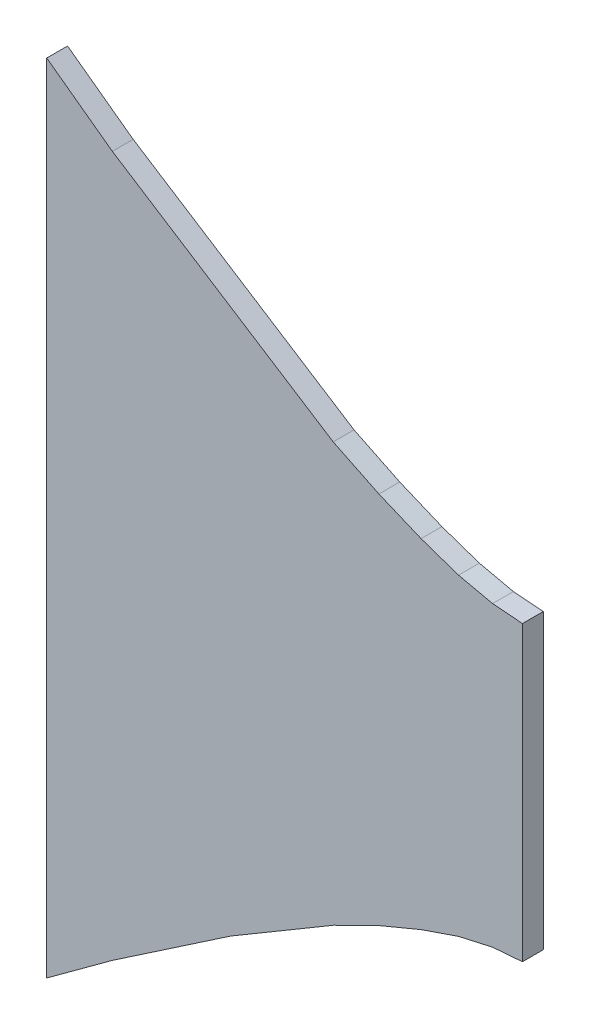
ISO-10303-21;
HEADER;
FILE_DESCRIPTION(('STEP AP214'),'2;1');
FILE_NAME('part.step','',(''),(''),'','','');
FILE_SCHEMA(('AUTOMOTIVE_DESIGN { 1 0 10303 214 1 1 1 1 }'));
ENDSEC;
DATA;
#1=APPLICATION_CONTEXT('core data for automotive mechanical design processes');
#2=APPLICATION_PROTOCOL_DEFINITION('international standard','automotive_design',2000,#1);
#3=PRODUCT_CONTEXT('',#1,'mechanical');
#4=PRODUCT('Part','Part','',(#3));
#5=PRODUCT_RELATED_PRODUCT_CATEGORY('part','',(#4));
#6=PRODUCT_DEFINITION_FORMATION('','',#4);
#7=PRODUCT_DEFINITION_CONTEXT('part definition',#1,'design');
#8=PRODUCT_DEFINITION('design','',#6,#7);
#9=PRODUCT_DEFINITION_SHAPE('','',#8);
#10=(LENGTH_UNIT() NAMED_UNIT(*) SI_UNIT(.MILLI.,.METRE.));
#11=(NAMED_UNIT(*) PLANE_ANGLE_UNIT() SI_UNIT($,.RADIAN.));
#12=(NAMED_UNIT(*) SI_UNIT($,.STERADIAN.) SOLID_ANGLE_UNIT());
#13=UNCERTAINTY_MEASURE_WITH_UNIT(LENGTH_MEASURE(1.E-05),#10,'distance_accuracy_value','');
#14=(GEOMETRIC_REPRESENTATION_CONTEXT(3) GLOBAL_UNCERTAINTY_ASSIGNED_CONTEXT((#13)) GLOBAL_UNIT_ASSIGNED_CONTEXT((#10,
#11,#12)) REPRESENTATION_CONTEXT('',''));
#15=CARTESIAN_POINT('',(0.,0.,0.));
#16=DIRECTION('',(0.,0.,1.));
#17=DIRECTION('',(1.,0.,0.));
#18=AXIS2_PLACEMENT_3D('',#15,#16,#17);
#19=CARTESIAN_POINT('',(40.7220001220703,86.0899963378906,0.));
#20=DIRECTION('',(-0.0782987833422963,-0.996929937622056,0.));
#21=DIRECTION('',(-0.996929937622056,0.0782987833422963,0.));
#22=AXIS2_PLACEMENT_3D('',#19,#20,#21);
#23=PLANE('',#22);
#24=DIRECTION('',(-0.996929937622056,0.0782987833422963,0.));
#25=VECTOR('',#24,1.);
#26=CARTESIAN_POINT('',(40.7220001220703,86.0899963378906,0.03556));
#27=LINE('',#26,#25);
#28=CARTESIAN_POINT('',(40.7220001220703,86.0899963378906,0.03556));
#29=VERTEX_POINT('',#28);
#30=CARTESIAN_POINT('',(40.6710014343262,86.0940017700195,0.03556));
#31=VERTEX_POINT('',#30);
#32=EDGE_CURVE('E11',#29,#31,#27,.T.);
#33=ORIENTED_EDGE('',*,*,#32,.F.);
#34=DIRECTION('',(0.,0.,1.));
#35=VECTOR('',#34,1.);
#36=CARTESIAN_POINT('',(40.7220001220703,86.0899963378906,0.));
#37=LINE('',#36,#35);
#38=CARTESIAN_POINT('',(40.7220001220703,86.0899963378906,0.));
#39=VERTEX_POINT('',#38);
#40=EDGE_CURVE('E24',#39,#29,#37,.T.);
#41=ORIENTED_EDGE('',*,*,#40,.F.);
#42=DIRECTION('',(-0.996929937622056,0.0782987833422963,0.));
#43=VECTOR('',#42,1.);
#44=CARTESIAN_POINT('',(40.7220001220703,86.0899963378906,0.));
#45=LINE('',#44,#43);
#46=CARTESIAN_POINT('',(40.6710014343262,86.0940017700195,0.));
#47=VERTEX_POINT('',#46);
#48=EDGE_CURVE('E154',#39,#47,#45,.T.);
#49=ORIENTED_EDGE('',*,*,#48,.T.);
#50=DIRECTION('',(0.,0.,1.));
#51=VECTOR('',#50,1.);
#52=CARTESIAN_POINT('',(40.6710014343262,86.0940017700195,0.));
#53=LINE('',#52,#51);
#54=EDGE_CURVE('E37',#47,#31,#53,.T.);
#55=ORIENTED_EDGE('',*,*,#54,.T.);
#56=EDGE_LOOP('',(#33,#41,#49,#55));
#57=FACE_BOUND('',#56,.T.);
#58=ADVANCED_FACE('F17',(#57),#23,.F.);
#59=CARTESIAN_POINT('',(40.6710014343262,86.0940017700195,0.));
#60=DIRECTION('',(-0.218710403369533,-0.975789813155444,0.));
#61=DIRECTION('',(-0.975789813155444,0.218710403369533,0.));
#62=AXIS2_PLACEMENT_3D('',#59,#60,#61);
#63=PLANE('',#62);
#64=DIRECTION('',(-0.975789813155444,0.218710403369533,0.));
#65=VECTOR('',#64,1.);
#66=CARTESIAN_POINT('',(40.6710014343262,86.0940017700195,0.03556));
#67=LINE('',#66,#65);
#68=CARTESIAN_POINT('',(40.6129989624023,86.1070022583008,0.03556));
#69=VERTEX_POINT('',#68);
#70=EDGE_CURVE('E266',#31,#69,#67,.T.);
#71=ORIENTED_EDGE('',*,*,#70,.F.);
#72=ORIENTED_EDGE('',*,*,#54,.F.);
#73=DIRECTION('',(-0.975789813155444,0.218710403369533,0.));
#74=VECTOR('',#73,1.);
#75=CARTESIAN_POINT('',(40.6710014343262,86.0940017700195,0.));
#76=LINE('',#75,#74);
#77=CARTESIAN_POINT('',(40.6129989624023,86.1070022583008,0.));
#78=VERTEX_POINT('',#77);
#79=EDGE_CURVE('E263',#47,#78,#76,.T.);
#80=ORIENTED_EDGE('',*,*,#79,.T.);
#81=DIRECTION('',(0.,0.,1.));
#82=VECTOR('',#81,1.);
#83=CARTESIAN_POINT('',(40.6129989624023,86.1070022583008,0.));
#84=LINE('',#83,#82);
#85=EDGE_CURVE('E261',#78,#69,#84,.T.);
#86=ORIENTED_EDGE('',*,*,#85,.T.);
#87=EDGE_LOOP('',(#71,#72,#80,#86));
#88=FACE_BOUND('',#87,.T.);
#89=ADVANCED_FACE('F274',(#88),#63,.F.);
#90=CARTESIAN_POINT('',(40.6129989624023,86.1070022583008,0.));
#91=DIRECTION('',(-0.32502462955719,-0.945705551522889,0.));
#92=DIRECTION('',(-0.945705551522889,0.32502462955719,0.));
#93=AXIS2_PLACEMENT_3D('',#90,#91,#92);
#94=PLANE('',#93);
#95=DIRECTION('',(-0.945705551522889,0.32502462955719,0.));
#96=VECTOR('',#95,1.);
#97=CARTESIAN_POINT('',(40.6129989624023,86.1070022583008,0.03556));
#98=LINE('',#97,#96);
#99=CARTESIAN_POINT('',(40.5489997863769,86.1289978027344,0.03556));
#100=VERTEX_POINT('',#99);
#101=EDGE_CURVE('E258',#69,#100,#98,.T.);
#102=ORIENTED_EDGE('',*,*,#101,.F.);
#103=ORIENTED_EDGE('',*,*,#85,.F.);
#104=DIRECTION('',(-0.945705551522889,0.32502462955719,0.));
#105=VECTOR('',#104,1.);
#106=CARTESIAN_POINT('',(40.6129989624023,86.1070022583008,0.));
#107=LINE('',#106,#105);
#108=CARTESIAN_POINT('',(40.5489997863769,86.1289978027344,0.));
#109=VERTEX_POINT('',#108);
#110=EDGE_CURVE('E255',#78,#109,#107,.T.);
#111=ORIENTED_EDGE('',*,*,#110,.T.);
#112=DIRECTION('',(0.,0.,1.));
#113=VECTOR('',#112,1.);
#114=CARTESIAN_POINT('',(40.5489997863769,86.1289978027344,0.));
#115=LINE('',#114,#113);
#116=EDGE_CURVE('E253',#109,#100,#115,.T.);
#117=ORIENTED_EDGE('',*,*,#116,.T.);
#118=EDGE_LOOP('',(#102,#103,#111,#117));
#119=FACE_BOUND('',#118,.T.);
#120=ADVANCED_FACE('F280',(#119),#94,.F.);
#121=CARTESIAN_POINT('',(40.5489997863769,86.1289978027344,0.));
#122=DIRECTION('',(-0.384608439163254,-0.923079816984645,0.));
#123=DIRECTION('',(-0.923079816984645,0.384608439163254,0.));
#124=AXIS2_PLACEMENT_3D('',#121,#122,#123);
#125=PLANE('',#124);
#126=DIRECTION('',(-0.923079816984645,0.384608439163254,0.));
#127=VECTOR('',#126,1.);
#128=CARTESIAN_POINT('',(40.5489997863769,86.1289978027344,0.03556));
#129=LINE('',#128,#127);
#130=CARTESIAN_POINT('',(40.4770011901855,86.1589965820312,0.03556));
#131=VERTEX_POINT('',#130);
#132=EDGE_CURVE('E250',#100,#131,#129,.T.);
#133=ORIENTED_EDGE('',*,*,#132,.F.);
#134=ORIENTED_EDGE('',*,*,#116,.F.);
#135=DIRECTION('',(-0.923079816984645,0.384608439163254,0.));
#136=VECTOR('',#135,1.);
#137=CARTESIAN_POINT('',(40.5489997863769,86.1289978027344,0.));
#138=LINE('',#137,#136);
#139=CARTESIAN_POINT('',(40.4770011901855,86.1589965820312,0.));
#140=VERTEX_POINT('',#139);
#141=EDGE_CURVE('E247',#109,#140,#138,.T.);
#142=ORIENTED_EDGE('',*,*,#141,.T.);
#143=DIRECTION('',(0.,0.,1.));
#144=VECTOR('',#143,1.);
#145=CARTESIAN_POINT('',(40.4770011901855,86.1589965820312,0.));
#146=LINE('',#145,#144);
#147=EDGE_CURVE('E245',#140,#131,#146,.T.);
#148=ORIENTED_EDGE('',*,*,#147,.T.);
#149=EDGE_LOOP('',(#133,#134,#142,#148));
#150=FACE_BOUND('',#149,.T.);
#151=ADVANCED_FACE('F282',(#150),#125,.F.);
#152=CARTESIAN_POINT('',(40.4770011901855,86.1589965820313,0.));
#153=DIRECTION('',(-0.437974889640196,-0.898987205718001,0.));
#154=DIRECTION('',(-0.898987205718001,0.437974889640196,0.));
#155=AXIS2_PLACEMENT_3D('',#152,#153,#154);
#156=PLANE('',#155);
#157=DIRECTION('',(-0.898987205718,0.437974889640196,0.));
#158=VECTOR('',#157,1.);
#159=CARTESIAN_POINT('',(40.4770011901855,86.1589965820312,0.03556));
#160=LINE('',#159,#158);
#161=CARTESIAN_POINT('',(40.3989982604981,86.1969985961914,0.03556));
#162=VERTEX_POINT('',#161);
#163=EDGE_CURVE('E242',#131,#162,#160,.T.);
#164=ORIENTED_EDGE('',*,*,#163,.F.);
#165=ORIENTED_EDGE('',*,*,#147,.F.);
#166=DIRECTION('',(-0.898987205718,0.437974889640196,0.));
#167=VECTOR('',#166,1.);
#168=CARTESIAN_POINT('',(40.4770011901855,86.1589965820312,0.));
#169=LINE('',#168,#167);
#170=CARTESIAN_POINT('',(40.3989982604981,86.1969985961914,0.));
#171=VERTEX_POINT('',#170);
#172=EDGE_CURVE('E239',#140,#171,#169,.T.);
#173=ORIENTED_EDGE('',*,*,#172,.T.);
#174=DIRECTION('',(0.,0.,1.));
#175=VECTOR('',#174,1.);
#176=CARTESIAN_POINT('',(40.3989982604981,86.1969985961914,0.));
#177=LINE('',#176,#175);
#178=EDGE_CURVE('E237',#171,#162,#177,.T.);
#179=ORIENTED_EDGE('',*,*,#178,.T.);
#180=EDGE_LOOP('',(#164,#165,#173,#179));
#181=FACE_BOUND('',#180,.T.);
#182=ADVANCED_FACE('F287',(#181),#156,.F.);
#183=CARTESIAN_POINT('',(40.3989982604981,86.1969985961914,0.));
#184=DIRECTION('',(-0.538618644530784,-0.842549675546683,0.));
#185=DIRECTION('',(-0.842549675546683,0.538618644530784,0.));
#186=AXIS2_PLACEMENT_3D('',#183,#184,#185);
#187=PLANE('',#186);
#188=DIRECTION('',(-0.842549675546683,0.538618644530784,0.));
#189=VECTOR('',#188,1.);
#190=CARTESIAN_POINT('',(40.3989982604981,86.1969985961914,0.03556));
#191=LINE('',#190,#189);
#192=CARTESIAN_POINT('',(40.0219993591309,86.4380035400391,0.03556));
#193=VERTEX_POINT('',#192);
#194=EDGE_CURVE('E234',#162,#193,#191,.T.);
#195=ORIENTED_EDGE('',*,*,#194,.F.);
#196=ORIENTED_EDGE('',*,*,#178,.F.);
#197=DIRECTION('',(-0.842549675546683,0.538618644530784,0.));
#198=VECTOR('',#197,1.);
#199=CARTESIAN_POINT('',(40.3989982604981,86.1969985961914,0.));
#200=LINE('',#199,#198);
#201=CARTESIAN_POINT('',(40.0219993591309,86.4380035400391,0.));
#202=VERTEX_POINT('',#201);
#203=EDGE_CURVE('E231',#171,#202,#200,.T.);
#204=ORIENTED_EDGE('',*,*,#203,.T.);
#205=DIRECTION('',(0.,0.,1.));
#206=VECTOR('',#205,1.);
#207=CARTESIAN_POINT('',(40.0219993591309,86.4380035400391,0.));
#208=LINE('',#207,#206);
#209=EDGE_CURVE('E229',#202,#193,#208,.T.);
#210=ORIENTED_EDGE('',*,*,#209,.T.);
#211=EDGE_LOOP('',(#195,#196,#204,#210));
#212=FACE_BOUND('',#211,.T.);
#213=ADVANCED_FACE('F290',(#212),#187,.F.);
#214=CARTESIAN_POINT('',(40.0219993591309,86.4380035400391,0.));
#215=DIRECTION('',(-0.590708178306999,-0.806885275662672,0.));
#216=DIRECTION('',(-0.806885275662672,0.590708178306999,0.));
#217=AXIS2_PLACEMENT_3D('',#214,#215,#216);
#218=PLANE('',#217);
#219=DIRECTION('',(-0.806885275662672,0.590708178306999,0.));
#220=VECTOR('',#219,1.);
#221=CARTESIAN_POINT('',(40.0219993591309,86.4380035400391,0.03556));
#222=LINE('',#221,#220);
#223=CARTESIAN_POINT('',(39.9099998474121,86.5199966430664,0.03556));
#224=VERTEX_POINT('',#223);
#225=EDGE_CURVE('E226',#193,#224,#222,.T.);
#226=ORIENTED_EDGE('',*,*,#225,.F.);
#227=ORIENTED_EDGE('',*,*,#209,.F.);
#228=DIRECTION('',(-0.806885275662672,0.590708178306999,0.));
#229=VECTOR('',#228,1.);
#230=CARTESIAN_POINT('',(40.0219993591309,86.4380035400391,0.));
#231=LINE('',#230,#229);
#232=CARTESIAN_POINT('',(39.9099998474121,86.5199966430664,0.));
#233=VERTEX_POINT('',#232);
#234=EDGE_CURVE('E223',#202,#233,#231,.T.);
#235=ORIENTED_EDGE('',*,*,#234,.T.);
#236=DIRECTION('',(0.,0.,1.));
#237=VECTOR('',#236,1.);
#238=CARTESIAN_POINT('',(39.9099998474121,86.5199966430664,0.));
#239=LINE('',#238,#237);
#240=EDGE_CURVE('E221',#233,#224,#239,.T.);
#241=ORIENTED_EDGE('',*,*,#240,.T.);
#242=EDGE_LOOP('',(#226,#227,#235,#241));
#243=FACE_BOUND('',#242,.T.);
#244=ADVANCED_FACE('F295',(#243),#218,.F.);
#245=CARTESIAN_POINT('',(39.9099998474121,86.5199966430664,0.));
#246=DIRECTION('',(1.,0.,0.));
#247=DIRECTION('',(0.,-1.,0.));
#248=AXIS2_PLACEMENT_3D('',#245,#246,#247);
#249=PLANE('',#248);
#250=DIRECTION('',(0.,-1.,0.));
#251=VECTOR('',#250,1.);
#252=CARTESIAN_POINT('',(39.9099998474121,86.5199966430664,0.03556));
#253=LINE('',#252,#251);
#254=CARTESIAN_POINT('',(39.9099998474121,85.1600036621094,0.03556));
#255=VERTEX_POINT('',#254);
#256=EDGE_CURVE('E218',#224,#255,#253,.T.);
#257=ORIENTED_EDGE('',*,*,#256,.F.);
#258=ORIENTED_EDGE('',*,*,#240,.F.);
#259=DIRECTION('',(0.,-1.,0.));
#260=VECTOR('',#259,1.);
#261=CARTESIAN_POINT('',(39.9099998474121,86.5199966430664,0.));
#262=LINE('',#261,#260);
#263=CARTESIAN_POINT('',(39.9099998474121,85.1600036621094,0.));
#264=VERTEX_POINT('',#263);
#265=EDGE_CURVE('E215',#233,#264,#262,.T.);
#266=ORIENTED_EDGE('',*,*,#265,.T.);
#267=DIRECTION('',(0.,0.,1.));
#268=VECTOR('',#267,1.);
#269=CARTESIAN_POINT('',(39.9099998474121,85.1600036621094,0.));
#270=LINE('',#269,#268);
#271=EDGE_CURVE('E213',#264,#255,#270,.T.);
#272=ORIENTED_EDGE('',*,*,#271,.T.);
#273=EDGE_LOOP('',(#257,#258,#266,#272));
#274=FACE_BOUND('',#273,.T.);
#275=ADVANCED_FACE('F298',(#274),#249,.F.);
#276=CARTESIAN_POINT('',(39.9099998474121,85.1600036621094,0.));
#277=DIRECTION('',(-0.590708178306999,0.806885275662672,0.));
#278=DIRECTION('',(0.806885275662672,0.590708178306999,0.));
#279=AXIS2_PLACEMENT_3D('',#276,#277,#278);
#280=PLANE('',#279);
#281=DIRECTION('',(0.806885275662672,0.590708178306999,0.));
#282=VECTOR('',#281,1.);
#283=CARTESIAN_POINT('',(39.9099998474121,85.1600036621094,0.03556));
#284=LINE('',#283,#282);
#285=CARTESIAN_POINT('',(40.0219993591309,85.2419967651367,0.03556));
#286=VERTEX_POINT('',#285);
#287=EDGE_CURVE('E210',#255,#286,#284,.T.);
#288=ORIENTED_EDGE('',*,*,#287,.F.);
#289=ORIENTED_EDGE('',*,*,#271,.F.);
#290=DIRECTION('',(0.806885275662672,0.590708178306999,0.));
#291=VECTOR('',#290,1.);
#292=CARTESIAN_POINT('',(39.9099998474121,85.1600036621094,0.));
#293=LINE('',#292,#291);
#294=CARTESIAN_POINT('',(40.0219993591309,85.2419967651367,0.));
#295=VERTEX_POINT('',#294);
#296=EDGE_CURVE('E207',#264,#295,#293,.T.);
#297=ORIENTED_EDGE('',*,*,#296,.T.);
#298=DIRECTION('',(0.,0.,1.));
#299=VECTOR('',#298,1.);
#300=CARTESIAN_POINT('',(40.0219993591309,85.2419967651367,0.));
#301=LINE('',#300,#299);
#302=EDGE_CURVE('E205',#295,#286,#301,.T.);
#303=ORIENTED_EDGE('',*,*,#302,.T.);
#304=EDGE_LOOP('',(#288,#289,#297,#303));
#305=FACE_BOUND('',#304,.T.);
#306=ADVANCED_FACE('F303',(#305),#280,.F.);
#307=CARTESIAN_POINT('',(40.0219993591309,85.2419967651367,0.));
#308=DIRECTION('',(-0.561304570964436,0.827609315205206,0.));
#309=DIRECTION('',(0.827609315205206,0.561304570964436,0.));
#310=AXIS2_PLACEMENT_3D('',#307,#308,#309);
#311=PLANE('',#310);
#312=DIRECTION('',(0.827609315205206,0.561304570964436,0.));
#313=VECTOR('',#312,1.);
#314=CARTESIAN_POINT('',(40.0219993591309,85.2419967651367,0.03556));
#315=LINE('',#314,#313);
#316=CARTESIAN_POINT('',(40.2239990234375,85.3789978027344,0.03556));
#317=VERTEX_POINT('',#316);
#318=EDGE_CURVE('E202',#286,#317,#315,.T.);
#319=ORIENTED_EDGE('',*,*,#318,.F.);
#320=ORIENTED_EDGE('',*,*,#302,.F.);
#321=DIRECTION('',(0.827609315205206,0.561304570964436,0.));
#322=VECTOR('',#321,1.);
#323=CARTESIAN_POINT('',(40.0219993591309,85.2419967651367,0.));
#324=LINE('',#323,#322);
#325=CARTESIAN_POINT('',(40.2239990234375,85.3789978027344,0.));
#326=VERTEX_POINT('',#325);
#327=EDGE_CURVE('E199',#295,#326,#324,.T.);
#328=ORIENTED_EDGE('',*,*,#327,.T.);
#329=DIRECTION('',(0.,0.,1.));
#330=VECTOR('',#329,1.);
#331=CARTESIAN_POINT('',(40.2239990234375,85.3789978027344,0.));
#332=LINE('',#331,#330);
#333=EDGE_CURVE('E197',#326,#317,#332,.T.);
#334=ORIENTED_EDGE('',*,*,#333,.T.);
#335=EDGE_LOOP('',(#319,#320,#328,#334));
#336=FACE_BOUND('',#335,.T.);
#337=ADVANCED_FACE('F306',(#336),#311,.F.);
#338=CARTESIAN_POINT('',(40.2239990234375,85.3789978027344,0.));
#339=DIRECTION('',(-0.508738113307092,0.860921327456081,0.));
#340=DIRECTION('',(0.860921327456081,0.508738113307092,0.));
#341=AXIS2_PLACEMENT_3D('',#338,#339,#340);
#342=PLANE('',#341);
#343=DIRECTION('',(0.860921327456081,0.508738113307092,0.));
#344=VECTOR('',#343,1.);
#345=CARTESIAN_POINT('',(40.2239990234375,85.3789978027344,0.03556));
#346=LINE('',#345,#344);
#347=CARTESIAN_POINT('',(40.4000015258789,85.4830017089844,0.03556));
#348=VERTEX_POINT('',#347);
#349=EDGE_CURVE('E194',#317,#348,#346,.T.);
#350=ORIENTED_EDGE('',*,*,#349,.F.);
#351=ORIENTED_EDGE('',*,*,#333,.F.);
#352=DIRECTION('',(0.860921327456081,0.508738113307092,0.));
#353=VECTOR('',#352,1.);
#354=CARTESIAN_POINT('',(40.2239990234375,85.3789978027344,0.));
#355=LINE('',#354,#353);
#356=CARTESIAN_POINT('',(40.4000015258789,85.4830017089844,0.));
#357=VERTEX_POINT('',#356);
#358=EDGE_CURVE('E191',#326,#357,#355,.T.);
#359=ORIENTED_EDGE('',*,*,#358,.T.);
#360=DIRECTION('',(0.,0.,1.));
#361=VECTOR('',#360,1.);
#362=CARTESIAN_POINT('',(40.4000015258789,85.4830017089844,0.));
#363=LINE('',#362,#361);
#364=EDGE_CURVE('E189',#357,#348,#363,.T.);
#365=ORIENTED_EDGE('',*,*,#364,.T.);
#366=EDGE_LOOP('',(#350,#351,#359,#365));
#367=FACE_BOUND('',#366,.T.);
#368=ADVANCED_FACE('F311',(#367),#342,.F.);
#369=CARTESIAN_POINT('',(40.4000015258789,85.4830017089844,0.));
#370=DIRECTION('',(-0.442569532299855,0.896734190872573,0.));
#371=DIRECTION('',(0.896734190872573,0.442569532299855,0.));
#372=AXIS2_PLACEMENT_3D('',#369,#370,#371);
#373=PLANE('',#372);
#374=DIRECTION('',(0.896734190872573,0.442569532299855,0.));
#375=VECTOR('',#374,1.);
#376=CARTESIAN_POINT('',(40.4000015258789,85.4830017089844,0.03556));
#377=LINE('',#376,#375);
#378=CARTESIAN_POINT('',(40.4770011901855,85.5210037231445,0.03556));
#379=VERTEX_POINT('',#378);
#380=EDGE_CURVE('E186',#348,#379,#377,.T.);
#381=ORIENTED_EDGE('',*,*,#380,.F.);
#382=ORIENTED_EDGE('',*,*,#364,.F.);
#383=DIRECTION('',(0.896734190872573,0.442569532299855,0.));
#384=VECTOR('',#383,1.);
#385=CARTESIAN_POINT('',(40.4000015258789,85.4830017089844,0.));
#386=LINE('',#385,#384);
#387=CARTESIAN_POINT('',(40.4770011901855,85.5210037231445,0.));
#388=VERTEX_POINT('',#387);
#389=EDGE_CURVE('E183',#357,#388,#386,.T.);
#390=ORIENTED_EDGE('',*,*,#389,.T.);
#391=DIRECTION('',(0.,0.,1.));
#392=VECTOR('',#391,1.);
#393=CARTESIAN_POINT('',(40.4770011901855,85.5210037231445,0.));
#394=LINE('',#393,#392);
#395=EDGE_CURVE('E181',#388,#379,#394,.T.);
#396=ORIENTED_EDGE('',*,*,#395,.T.);
#397=EDGE_LOOP('',(#381,#382,#390,#396));
#398=FACE_BOUND('',#397,.T.);
#399=ADVANCED_FACE('F314',(#398),#373,.F.);
#400=CARTESIAN_POINT('',(40.4770011901855,85.5210037231445,0.));
#401=DIRECTION('',(-0.384608439163254,0.923079816984645,0.));
#402=DIRECTION('',(0.923079816984645,0.384608439163254,0.));
#403=AXIS2_PLACEMENT_3D('',#400,#401,#402);
#404=PLANE('',#403);
#405=DIRECTION('',(0.923079816984645,0.384608439163254,0.));
#406=VECTOR('',#405,1.);
#407=CARTESIAN_POINT('',(40.4770011901855,85.5210037231445,0.03556));
#408=LINE('',#407,#406);
#409=CARTESIAN_POINT('',(40.5489997863769,85.5510025024414,0.03556));
#410=VERTEX_POINT('',#409);
#411=EDGE_CURVE('E178',#379,#410,#408,.T.);
#412=ORIENTED_EDGE('',*,*,#411,.F.);
#413=ORIENTED_EDGE('',*,*,#395,.F.);
#414=DIRECTION('',(0.923079816984645,0.384608439163254,0.));
#415=VECTOR('',#414,1.);
#416=CARTESIAN_POINT('',(40.4770011901855,85.5210037231445,0.));
#417=LINE('',#416,#415);
#418=CARTESIAN_POINT('',(40.5489997863769,85.5510025024414,0.));
#419=VERTEX_POINT('',#418);
#420=EDGE_CURVE('E175',#388,#419,#417,.T.);
#421=ORIENTED_EDGE('',*,*,#420,.T.);
#422=DIRECTION('',(0.,0.,1.));
#423=VECTOR('',#422,1.);
#424=CARTESIAN_POINT('',(40.5489997863769,85.5510025024414,0.));
#425=LINE('',#424,#423);
#426=EDGE_CURVE('E173',#419,#410,#425,.T.);
#427=ORIENTED_EDGE('',*,*,#426,.T.);
#428=EDGE_LOOP('',(#412,#413,#421,#427));
#429=FACE_BOUND('',#428,.T.);
#430=ADVANCED_FACE('F319',(#429),#404,.F.);
#431=CARTESIAN_POINT('',(40.5489997863769,85.5510025024414,0.));
#432=DIRECTION('',(-0.32502462955719,0.945705551522889,0.));
#433=DIRECTION('',(0.945705551522889,0.32502462955719,0.));
#434=AXIS2_PLACEMENT_3D('',#431,#432,#433);
#435=PLANE('',#434);
#436=DIRECTION('',(0.945705551522889,0.32502462955719,0.));
#437=VECTOR('',#436,1.);
#438=CARTESIAN_POINT('',(40.5489997863769,85.5510025024414,0.03556));
#439=LINE('',#438,#437);
#440=CARTESIAN_POINT('',(40.6129989624023,85.572998046875,0.03556));
#441=VERTEX_POINT('',#440);
#442=EDGE_CURVE('E170',#410,#441,#439,.T.);
#443=ORIENTED_EDGE('',*,*,#442,.F.);
#444=ORIENTED_EDGE('',*,*,#426,.F.);
#445=DIRECTION('',(0.945705551522889,0.32502462955719,0.));
#446=VECTOR('',#445,1.);
#447=CARTESIAN_POINT('',(40.5489997863769,85.5510025024414,0.));
#448=LINE('',#447,#446);
#449=CARTESIAN_POINT('',(40.6129989624023,85.572998046875,0.));
#450=VERTEX_POINT('',#449);
#451=EDGE_CURVE('E167',#419,#450,#448,.T.);
#452=ORIENTED_EDGE('',*,*,#451,.T.);
#453=DIRECTION('',(0.,0.,1.));
#454=VECTOR('',#453,1.);
#455=CARTESIAN_POINT('',(40.6129989624023,85.572998046875,0.));
#456=LINE('',#455,#454);
#457=EDGE_CURVE('E165',#450,#441,#456,.T.);
#458=ORIENTED_EDGE('',*,*,#457,.T.);
#459=EDGE_LOOP('',(#443,#444,#452,#458));
#460=FACE_BOUND('',#459,.T.);
#461=ADVANCED_FACE('F322',(#460),#435,.F.);
#462=CARTESIAN_POINT('',(40.6129989624023,85.572998046875,0.));
#463=DIRECTION('',(-0.218710403369533,0.975789813155444,0.));
#464=DIRECTION('',(0.975789813155444,0.218710403369533,0.));
#465=AXIS2_PLACEMENT_3D('',#462,#463,#464);
#466=PLANE('',#465);
#467=DIRECTION('',(0.975789813155444,0.218710403369533,0.));
#468=VECTOR('',#467,1.);
#469=CARTESIAN_POINT('',(40.6129989624023,85.572998046875,0.03556));
#470=LINE('',#469,#468);
#471=CARTESIAN_POINT('',(40.6710014343262,85.5859985351562,0.03556));
#472=VERTEX_POINT('',#471);
#473=EDGE_CURVE('E162',#441,#472,#470,.T.);
#474=ORIENTED_EDGE('',*,*,#473,.F.);
#475=ORIENTED_EDGE('',*,*,#457,.F.);
#476=DIRECTION('',(0.975789813155444,0.218710403369533,0.));
#477=VECTOR('',#476,1.);
#478=CARTESIAN_POINT('',(40.6129989624023,85.572998046875,0.));
#479=LINE('',#478,#477);
#480=CARTESIAN_POINT('',(40.6710014343262,85.5859985351562,0.));
#481=VERTEX_POINT('',#480);
#482=EDGE_CURVE('E160',#450,#481,#479,.T.);
#483=ORIENTED_EDGE('',*,*,#482,.T.);
#484=DIRECTION('',(0.,0.,1.));
#485=VECTOR('',#484,1.);
#486=CARTESIAN_POINT('',(40.6710014343262,85.5859985351562,0.));
#487=LINE('',#486,#485);
#488=EDGE_CURVE('E145',#481,#472,#487,.T.);
#489=ORIENTED_EDGE('',*,*,#488,.T.);
#490=EDGE_LOOP('',(#474,#475,#483,#489));
#491=FACE_BOUND('',#490,.T.);
#492=ADVANCED_FACE('F325',(#491),#466,.F.);
#493=CARTESIAN_POINT('',(40.6710014343262,85.5859985351562,0.));
#494=DIRECTION('',(-0.0781505545436505,0.996941568410366,0.));
#495=DIRECTION('',(0.996941568410366,0.0781505545436505,0.));
#496=AXIS2_PLACEMENT_3D('',#493,#494,#495);
#497=PLANE('',#496);
#498=DIRECTION('',(0.996941568410366,0.0781505545436505,0.));
#499=VECTOR('',#498,1.);
#500=CARTESIAN_POINT('',(40.6710014343262,85.5859985351562,0.03556));
#501=LINE('',#500,#499);
#502=CARTESIAN_POINT('',(40.7220001220703,85.5899963378906,0.03556));
#503=VERTEX_POINT('',#502);
#504=EDGE_CURVE('E149',#472,#503,#501,.T.);
#505=ORIENTED_EDGE('',*,*,#504,.F.);
#506=ORIENTED_EDGE('',*,*,#488,.F.);
#507=DIRECTION('',(0.996941568410366,0.0781505545436505,0.));
#508=VECTOR('',#507,1.);
#509=CARTESIAN_POINT('',(40.6710014343262,85.5859985351562,0.));
#510=LINE('',#509,#508);
#511=CARTESIAN_POINT('',(40.7220001220703,85.5899963378906,0.));
#512=VERTEX_POINT('',#511);
#513=EDGE_CURVE('E141',#481,#512,#510,.T.);
#514=ORIENTED_EDGE('',*,*,#513,.T.);
#515=DIRECTION('',(0.,0.,1.));
#516=VECTOR('',#515,1.);
#517=CARTESIAN_POINT('',(40.7220001220703,85.5899963378906,0.));
#518=LINE('',#517,#516);
#519=EDGE_CURVE('E131',#512,#503,#518,.T.);
#520=ORIENTED_EDGE('',*,*,#519,.T.);
#521=EDGE_LOOP('',(#505,#506,#514,#520));
#522=FACE_BOUND('',#521,.T.);
#523=ADVANCED_FACE('F144',(#522),#497,.F.);
#524=CARTESIAN_POINT('',(40.7220001220703,85.5899963378906,0.));
#525=DIRECTION('',(-1.,0.,0.));
#526=DIRECTION('',(0.,1.,0.));
#527=AXIS2_PLACEMENT_3D('',#524,#525,#526);
#528=PLANE('',#527);
#529=DIRECTION('',(0.,1.,0.));
#530=VECTOR('',#529,1.);
#531=CARTESIAN_POINT('',(40.7220001220703,85.5899963378906,0.03556));
#532=LINE('',#531,#530);
#533=EDGE_CURVE('E137',#503,#29,#532,.T.);
#534=ORIENTED_EDGE('',*,*,#533,.F.);
#535=ORIENTED_EDGE('',*,*,#519,.F.);
#536=DIRECTION('',(0.,1.,0.));
#537=VECTOR('',#536,1.);
#538=CARTESIAN_POINT('',(40.7220001220703,85.5899963378906,0.));
#539=LINE('',#538,#537);
#540=EDGE_CURVE('E135',#512,#39,#539,.T.);
#541=ORIENTED_EDGE('',*,*,#540,.T.);
#542=ORIENTED_EDGE('',*,*,#40,.T.);
#543=EDGE_LOOP('',(#534,#535,#541,#542));
#544=FACE_BOUND('',#543,.T.);
#545=ADVANCED_FACE('F133',(#544),#528,.F.);
#546=CARTESIAN_POINT('',(40.7220001220703,86.0899963378906,0.));
#547=DIRECTION('',(0.,0.,1.));
#548=DIRECTION('',(1.,0.,0.));
#549=AXIS2_PLACEMENT_3D('',#546,#547,#548);
#550=PLANE('',#549);
#551=ORIENTED_EDGE('',*,*,#540,.F.);
#552=ORIENTED_EDGE('',*,*,#513,.F.);
#553=ORIENTED_EDGE('',*,*,#482,.F.);
#554=ORIENTED_EDGE('',*,*,#451,.F.);
#555=ORIENTED_EDGE('',*,*,#420,.F.);
#556=ORIENTED_EDGE('',*,*,#389,.F.);
#557=ORIENTED_EDGE('',*,*,#358,.F.);
#558=ORIENTED_EDGE('',*,*,#327,.F.);
#559=ORIENTED_EDGE('',*,*,#296,.F.);
#560=ORIENTED_EDGE('',*,*,#265,.F.);
#561=ORIENTED_EDGE('',*,*,#234,.F.);
#562=ORIENTED_EDGE('',*,*,#203,.F.);
#563=ORIENTED_EDGE('',*,*,#172,.F.);
#564=ORIENTED_EDGE('',*,*,#141,.F.);
#565=ORIENTED_EDGE('',*,*,#110,.F.);
#566=ORIENTED_EDGE('',*,*,#79,.F.);
#567=ORIENTED_EDGE('',*,*,#48,.F.);
#568=EDGE_LOOP('',(#551,#552,#553,#554,#555,#556,#557,#558,#559,#560,#561,#562,#563,#564,#565,
#566,#567));
#569=FACE_BOUND('',#568,.T.);
#570=ADVANCED_FACE('F152',(#569),#550,.F.);
#571=CARTESIAN_POINT('',(40.7220001220703,86.0899963378906,0.03556));
#572=DIRECTION('',(0.,0.,1.));
#573=DIRECTION('',(1.,0.,0.));
#574=AXIS2_PLACEMENT_3D('',#571,#572,#573);
#575=PLANE('',#574);
#576=ORIENTED_EDGE('',*,*,#32,.T.);
#577=ORIENTED_EDGE('',*,*,#70,.T.);
#578=ORIENTED_EDGE('',*,*,#101,.T.);
#579=ORIENTED_EDGE('',*,*,#132,.T.);
#580=ORIENTED_EDGE('',*,*,#163,.T.);
#581=ORIENTED_EDGE('',*,*,#194,.T.);
#582=ORIENTED_EDGE('',*,*,#225,.T.);
#583=ORIENTED_EDGE('',*,*,#256,.T.);
#584=ORIENTED_EDGE('',*,*,#287,.T.);
#585=ORIENTED_EDGE('',*,*,#318,.T.);
#586=ORIENTED_EDGE('',*,*,#349,.T.);
#587=ORIENTED_EDGE('',*,*,#380,.T.);
#588=ORIENTED_EDGE('',*,*,#411,.T.);
#589=ORIENTED_EDGE('',*,*,#442,.T.);
#590=ORIENTED_EDGE('',*,*,#473,.T.);
#591=ORIENTED_EDGE('',*,*,#504,.T.);
#592=ORIENTED_EDGE('',*,*,#533,.T.);
#593=EDGE_LOOP('',(#576,#577,#578,#579,#580,#581,#582,#583,#584,#585,#586,#587,#588,#589,#590,
#591,#592));
#594=FACE_BOUND('',#593,.T.);
#595=ADVANCED_FACE('F277',(#594),#575,.T.);
#596=CLOSED_SHELL('',(#58,#89,#120,#151,#182,#213,#244,#275,#306,#337,#368,#399,#430,#461,#492,
#523,#545,#570,#595));
#597=MANIFOLD_SOLID_BREP('B1',#596);
#598=ADVANCED_BREP_SHAPE_REPRESENTATION('',(#18,#597),#14);
#599=SHAPE_DEFINITION_REPRESENTATION(#9,#598);
ENDSEC;
END-ISO-10303-21;
